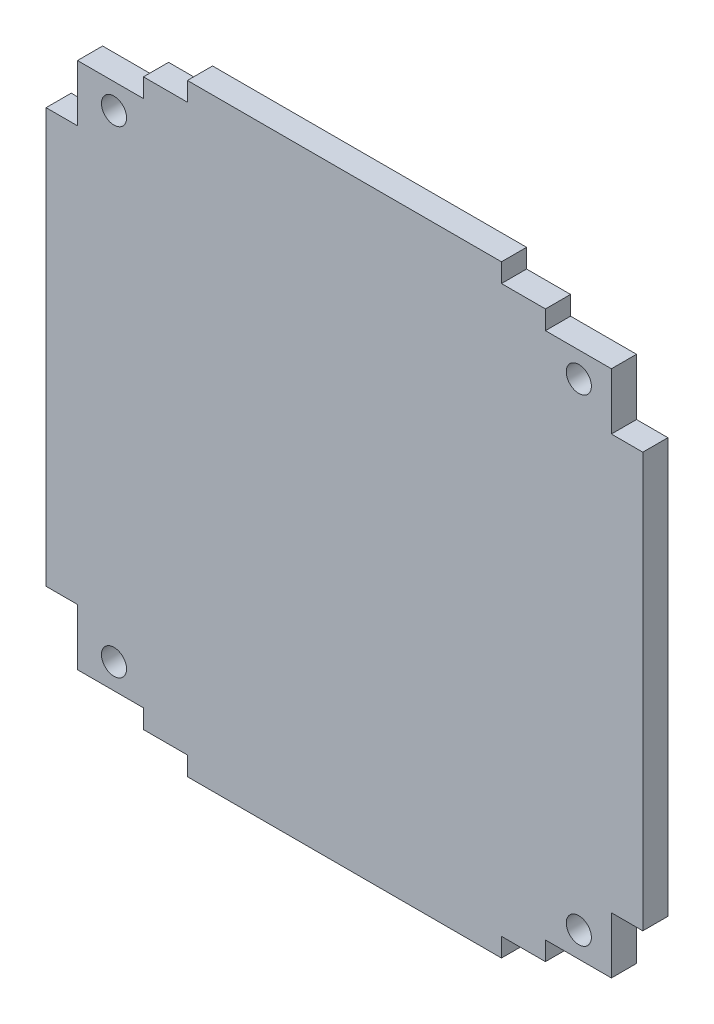
ISO-10303-21;
HEADER;
FILE_DESCRIPTION(('STEP AP214'),'2;1');
FILE_NAME('part.step','',(''),(''),'','','');
FILE_SCHEMA(('AUTOMOTIVE_DESIGN { 1 0 10303 214 1 1 1 1 }'));
ENDSEC;
DATA;
#1=APPLICATION_CONTEXT('core data for automotive mechanical design processes');
#2=APPLICATION_PROTOCOL_DEFINITION('international standard','automotive_design',2000,#1);
#3=PRODUCT_CONTEXT('',#1,'mechanical');
#4=PRODUCT('Part','Part','',(#3));
#5=PRODUCT_RELATED_PRODUCT_CATEGORY('part','',(#4));
#6=PRODUCT_DEFINITION_FORMATION('','',#4);
#7=PRODUCT_DEFINITION_CONTEXT('part definition',#1,'design');
#8=PRODUCT_DEFINITION('design','',#6,#7);
#9=PRODUCT_DEFINITION_SHAPE('','',#8);
#10=(LENGTH_UNIT() NAMED_UNIT(*) SI_UNIT(.MILLI.,.METRE.));
#11=(NAMED_UNIT(*) PLANE_ANGLE_UNIT() SI_UNIT($,.RADIAN.));
#12=(NAMED_UNIT(*) SI_UNIT($,.STERADIAN.) SOLID_ANGLE_UNIT());
#13=UNCERTAINTY_MEASURE_WITH_UNIT(LENGTH_MEASURE(1.E-05),#10,'distance_accuracy_value','');
#14=(GEOMETRIC_REPRESENTATION_CONTEXT(3) GLOBAL_UNCERTAINTY_ASSIGNED_CONTEXT((#13)) GLOBAL_UNIT_ASSIGNED_CONTEXT((#10,
#11,#12)) REPRESENTATION_CONTEXT('',''));
#15=CARTESIAN_POINT('',(0.,0.,0.));
#16=DIRECTION('',(0.,0.,1.));
#17=DIRECTION('',(1.,0.,0.));
#18=AXIS2_PLACEMENT_3D('',#15,#16,#17);
#19=CARTESIAN_POINT('',(42.185985468852,-41.9999998962809,4.));
#20=DIRECTION('',(-0.999999999999999,3.79117308534226E-08,0.));
#21=DIRECTION('',(-3.79117308534226E-08,-0.999999999999999,0.));
#22=AXIS2_PLACEMENT_3D('',#19,#20,#21);
#23=PLANE('',#22);
#24=DIRECTION('',(3.79117308534226E-08,0.999999999999999,0.));
#25=VECTOR('',#24,1.);
#26=CARTESIAN_POINT('',(42.185985468852,-41.9999998962809,0.));
#27=LINE('',#26,#25);
#28=CARTESIAN_POINT('',(42.185985468852,-41.9999998962809,0.));
#29=VERTEX_POINT('',#28);
#30=CARTESIAN_POINT('',(42.1859858100575,-32.9999998962809,0.));
#31=VERTEX_POINT('',#30);
#32=EDGE_CURVE('E259',#29,#31,#27,.T.);
#33=ORIENTED_EDGE('',*,*,#32,.T.);
#34=DIRECTION('',(0.,0.,-1.));
#35=VECTOR('',#34,1.);
#36=CARTESIAN_POINT('',(42.1859858100575,-32.9999998962809,4.));
#37=LINE('',#36,#35);
#38=CARTESIAN_POINT('',(42.1859858100575,-32.9999998962809,4.));
#39=VERTEX_POINT('',#38);
#40=EDGE_CURVE('E11',#39,#31,#37,.T.);
#41=ORIENTED_EDGE('',*,*,#40,.F.);
#42=DIRECTION('',(3.79117308534226E-08,0.999999999999999,0.));
#43=VECTOR('',#42,1.);
#44=CARTESIAN_POINT('',(42.185985468852,-41.9999998962809,4.));
#45=LINE('',#44,#43);
#46=CARTESIAN_POINT('',(42.185985468852,-41.9999998962809,4.));
#47=VERTEX_POINT('',#46);
#48=EDGE_CURVE('E313',#47,#39,#45,.T.);
#49=ORIENTED_EDGE('',*,*,#48,.F.);
#50=DIRECTION('',(0.,0.,-1.));
#51=VECTOR('',#50,1.);
#52=CARTESIAN_POINT('',(42.185985468852,-41.9999998962809,4.));
#53=LINE('',#52,#51);
#54=EDGE_CURVE('E255',#47,#29,#53,.T.);
#55=ORIENTED_EDGE('',*,*,#54,.T.);
#56=EDGE_LOOP('',(#33,#41,#49,#55));
#57=FACE_BOUND('',#56,.T.);
#58=ADVANCED_FACE('F41',(#57),#23,.F.);
#59=CARTESIAN_POINT('',(42.1859858100575,-32.9999998962809,4.));
#60=DIRECTION('',(3.57590861161203E-09,1.,0.));
#61=DIRECTION('',(-1.,3.57590861161203E-09,0.));
#62=AXIS2_PLACEMENT_3D('',#59,#60,#61);
#63=PLANE('',#62);
#64=DIRECTION('',(1.,-3.57590861161203E-09,0.));
#65=VECTOR('',#64,1.);
#66=CARTESIAN_POINT('',(42.1859858100575,-32.9999998962809,0.));
#67=LINE('',#66,#65);
#68=CARTESIAN_POINT('',(47.1859883122317,-32.9999999141604,0.));
#69=VERTEX_POINT('',#68);
#70=EDGE_CURVE('E262',#31,#69,#67,.T.);
#71=ORIENTED_EDGE('',*,*,#70,.T.);
#72=DIRECTION('',(0.,0.,-1.));
#73=VECTOR('',#72,1.);
#74=CARTESIAN_POINT('',(47.1859883122317,-32.9999999141604,4.));
#75=LINE('',#74,#73);
#76=CARTESIAN_POINT('',(47.1859883122317,-32.9999999141604,4.));
#77=VERTEX_POINT('',#76);
#78=EDGE_CURVE('E50',#77,#69,#75,.T.);
#79=ORIENTED_EDGE('',*,*,#78,.F.);
#80=DIRECTION('',(1.,-3.57590861161203E-09,0.));
#81=VECTOR('',#80,1.);
#82=CARTESIAN_POINT('',(42.1859858100575,-32.9999998962809,4.));
#83=LINE('',#82,#81);
#84=EDGE_CURVE('E162',#39,#77,#83,.T.);
#85=ORIENTED_EDGE('',*,*,#84,.F.);
#86=ORIENTED_EDGE('',*,*,#40,.T.);
#87=EDGE_LOOP('',(#71,#79,#85,#86));
#88=FACE_BOUND('',#87,.T.);
#89=ADVANCED_FACE('F427',(#88),#63,.F.);
#90=CARTESIAN_POINT('',(47.1859858100575,33.0000000858395,4.));
#91=DIRECTION('',(-0.999999999999999,-3.79117300473895E-08,0.));
#92=DIRECTION('',(3.79117300473895E-08,-0.999999999999999,0.));
#93=AXIS2_PLACEMENT_3D('',#90,#91,#92);
#94=PLANE('',#93);
#95=DIRECTION('',(-3.79117300473895E-08,0.999999999999999,0.));
#96=VECTOR('',#95,1.);
#97=CARTESIAN_POINT('',(47.1859858100575,33.0000000858395,0.));
#98=LINE('',#97,#96);
#99=CARTESIAN_POINT('',(47.1859858100575,33.0000000858395,0.));
#100=VERTEX_POINT('',#99);
#101=EDGE_CURVE('E264',#69,#100,#98,.T.);
#102=ORIENTED_EDGE('',*,*,#101,.T.);
#103=DIRECTION('',(0.,0.,-1.));
#104=VECTOR('',#103,1.);
#105=CARTESIAN_POINT('',(47.1859858100575,33.0000000858395,4.));
#106=LINE('',#105,#104);
#107=CARTESIAN_POINT('',(47.1859858100575,33.0000000858395,4.));
#108=VERTEX_POINT('',#107);
#109=EDGE_CURVE('E380',#108,#100,#106,.T.);
#110=ORIENTED_EDGE('',*,*,#109,.F.);
#111=DIRECTION('',(-3.79117300473895E-08,0.999999999999999,0.));
#112=VECTOR('',#111,1.);
#113=CARTESIAN_POINT('',(47.1859858100575,33.0000000858395,4.));
#114=LINE('',#113,#112);
#115=EDGE_CURVE('E609',#77,#108,#114,.T.);
#116=ORIENTED_EDGE('',*,*,#115,.F.);
#117=ORIENTED_EDGE('',*,*,#78,.T.);
#118=EDGE_LOOP('',(#102,#110,#116,#117));
#119=FACE_BOUND('',#118,.T.);
#120=ADVANCED_FACE('F431',(#119),#94,.F.);
#121=CARTESIAN_POINT('',(42.1859858100575,32.9999998962809,4.));
#122=DIRECTION('',(3.79117293114462E-08,-0.999999999999999,0.));
#123=DIRECTION('',(0.999999999999999,3.79117293114462E-08,0.));
#124=AXIS2_PLACEMENT_3D('',#121,#122,#123);
#125=PLANE('',#124);
#126=DIRECTION('',(-0.999999999999999,-3.79117293114462E-08,0.));
#127=VECTOR('',#126,1.);
#128=CARTESIAN_POINT('',(42.1859858100575,32.9999998962809,0.));
#129=LINE('',#128,#127);
#130=CARTESIAN_POINT('',(42.1859858100575,32.9999998962809,0.));
#131=VERTEX_POINT('',#130);
#132=EDGE_CURVE('E266',#100,#131,#129,.T.);
#133=ORIENTED_EDGE('',*,*,#132,.T.);
#134=DIRECTION('',(0.,0.,-1.));
#135=VECTOR('',#134,1.);
#136=CARTESIAN_POINT('',(42.1859858100575,32.9999998962809,4.));
#137=LINE('',#136,#135);
#138=CARTESIAN_POINT('',(42.1859858100575,32.9999998962809,4.));
#139=VERTEX_POINT('',#138);
#140=EDGE_CURVE('E377',#139,#131,#137,.T.);
#141=ORIENTED_EDGE('',*,*,#140,.F.);
#142=DIRECTION('',(-0.999999999999999,-3.79117293114462E-08,0.));
#143=VECTOR('',#142,1.);
#144=CARTESIAN_POINT('',(42.1859858100575,32.9999998962809,4.));
#145=LINE('',#144,#143);
#146=EDGE_CURVE('E611',#108,#139,#145,.T.);
#147=ORIENTED_EDGE('',*,*,#146,.F.);
#148=ORIENTED_EDGE('',*,*,#109,.T.);
#149=EDGE_LOOP('',(#133,#141,#147,#148));
#150=FACE_BOUND('',#149,.T.);
#151=ADVANCED_FACE('F435',(#150),#125,.F.);
#152=CARTESIAN_POINT('',(42.185985468852,41.9999998962809,4.));
#153=DIRECTION('',(-0.999999999999999,-3.79117308534226E-08,0.));
#154=DIRECTION('',(3.79117308534226E-08,-0.999999999999999,0.));
#155=AXIS2_PLACEMENT_3D('',#152,#153,#154);
#156=PLANE('',#155);
#157=DIRECTION('',(-3.79117308534226E-08,0.999999999999999,0.));
#158=VECTOR('',#157,1.);
#159=CARTESIAN_POINT('',(42.185985468852,41.9999998962809,0.));
#160=LINE('',#159,#158);
#161=CARTESIAN_POINT('',(42.185985468852,41.9999998962809,0.));
#162=VERTEX_POINT('',#161);
#163=EDGE_CURVE('E268',#131,#162,#160,.T.);
#164=ORIENTED_EDGE('',*,*,#163,.T.);
#165=DIRECTION('',(0.,0.,-1.));
#166=VECTOR('',#165,1.);
#167=CARTESIAN_POINT('',(42.185985468852,41.9999998962809,4.));
#168=LINE('',#167,#166);
#169=CARTESIAN_POINT('',(42.185985468852,41.9999998962809,4.));
#170=VERTEX_POINT('',#169);
#171=EDGE_CURVE('E374',#170,#162,#168,.T.);
#172=ORIENTED_EDGE('',*,*,#171,.F.);
#173=DIRECTION('',(-3.79117308534226E-08,0.999999999999999,0.));
#174=VECTOR('',#173,1.);
#175=CARTESIAN_POINT('',(42.185985468852,41.9999998962809,4.));
#176=LINE('',#175,#174);
#177=EDGE_CURVE('E613',#139,#170,#176,.T.);
#178=ORIENTED_EDGE('',*,*,#177,.F.);
#179=ORIENTED_EDGE('',*,*,#140,.T.);
#180=EDGE_LOOP('',(#164,#172,#178,#179));
#181=FACE_BOUND('',#180,.T.);
#182=ADVANCED_FACE('F441',(#181),#156,.F.);
#183=CARTESIAN_POINT('',(31.6859854688523,41.9999994982078,4.));
#184=DIRECTION('',(3.79117200595888E-08,-0.999999999999999,0.));
#185=DIRECTION('',(0.999999999999999,3.79117200595888E-08,0.));
#186=AXIS2_PLACEMENT_3D('',#183,#184,#185);
#187=PLANE('',#186);
#188=DIRECTION('',(-0.999999999999999,-3.79117200595888E-08,0.));
#189=VECTOR('',#188,1.);
#190=CARTESIAN_POINT('',(31.6859854688523,41.9999994982078,0.));
#191=LINE('',#190,#189);
#192=CARTESIAN_POINT('',(31.6859854688523,41.9999994982078,0.));
#193=VERTEX_POINT('',#192);
#194=EDGE_CURVE('E270',#162,#193,#191,.T.);
#195=ORIENTED_EDGE('',*,*,#194,.T.);
#196=DIRECTION('',(0.,0.,-1.));
#197=VECTOR('',#196,1.);
#198=CARTESIAN_POINT('',(31.6859854688523,41.9999994982078,4.));
#199=LINE('',#198,#197);
#200=CARTESIAN_POINT('',(31.6859854688523,41.9999994982078,4.));
#201=VERTEX_POINT('',#200);
#202=EDGE_CURVE('E371',#201,#193,#199,.T.);
#203=ORIENTED_EDGE('',*,*,#202,.F.);
#204=DIRECTION('',(-0.999999999999999,-3.79117200595888E-08,0.));
#205=VECTOR('',#204,1.);
#206=CARTESIAN_POINT('',(31.6859854688523,41.9999994982078,4.));
#207=LINE('',#206,#205);
#208=EDGE_CURVE('E615',#170,#201,#207,.T.);
#209=ORIENTED_EDGE('',*,*,#208,.F.);
#210=ORIENTED_EDGE('',*,*,#171,.T.);
#211=EDGE_LOOP('',(#195,#203,#209,#210));
#212=FACE_BOUND('',#211,.T.);
#213=ADVANCED_FACE('F445',(#212),#187,.F.);
#214=CARTESIAN_POINT('',(31.6859853551171,44.9999994982078,4.));
#215=DIRECTION('',(-0.999999999999999,-3.79117293114463E-08,0.));
#216=DIRECTION('',(3.79117293114463E-08,-0.999999999999999,0.));
#217=AXIS2_PLACEMENT_3D('',#214,#215,#216);
#218=PLANE('',#217);
#219=DIRECTION('',(-3.79117293114463E-08,0.999999999999999,0.));
#220=VECTOR('',#219,1.);
#221=CARTESIAN_POINT('',(31.6859853551171,44.9999994982078,0.));
#222=LINE('',#221,#220);
#223=CARTESIAN_POINT('',(31.6859853551171,44.9999994982078,0.));
#224=VERTEX_POINT('',#223);
#225=EDGE_CURVE('E272',#193,#224,#222,.T.);
#226=ORIENTED_EDGE('',*,*,#225,.T.);
#227=DIRECTION('',(0.,0.,-1.));
#228=VECTOR('',#227,1.);
#229=CARTESIAN_POINT('',(31.6859853551171,44.9999994982078,4.));
#230=LINE('',#229,#228);
#231=CARTESIAN_POINT('',(31.6859853551171,44.9999994982078,4.));
#232=VERTEX_POINT('',#231);
#233=EDGE_CURVE('E368',#232,#224,#230,.T.);
#234=ORIENTED_EDGE('',*,*,#233,.F.);
#235=DIRECTION('',(-3.79117293114463E-08,0.999999999999999,0.));
#236=VECTOR('',#235,1.);
#237=CARTESIAN_POINT('',(31.6859853551171,44.9999994982078,4.));
#238=LINE('',#237,#236);
#239=EDGE_CURVE('E617',#201,#232,#238,.T.);
#240=ORIENTED_EDGE('',*,*,#239,.F.);
#241=ORIENTED_EDGE('',*,*,#202,.T.);
#242=EDGE_LOOP('',(#226,#234,#240,#241));
#243=FACE_BOUND('',#242,.T.);
#244=ADVANCED_FACE('F449',(#243),#218,.F.);
#245=CARTESIAN_POINT('',(24.6859853551169,44.9999992328257,4.));
#246=DIRECTION('',(3.79117303027153E-08,-0.999999999999999,0.));
#247=DIRECTION('',(0.999999999999999,3.79117303027153E-08,0.));
#248=AXIS2_PLACEMENT_3D('',#245,#246,#247);
#249=PLANE('',#248);
#250=DIRECTION('',(-0.999999999999999,-3.79117303027153E-08,0.));
#251=VECTOR('',#250,1.);
#252=CARTESIAN_POINT('',(24.6859853551169,44.9999992328257,0.));
#253=LINE('',#252,#251);
#254=CARTESIAN_POINT('',(24.6859853551169,44.9999992328257,0.));
#255=VERTEX_POINT('',#254);
#256=EDGE_CURVE('E274',#224,#255,#253,.T.);
#257=ORIENTED_EDGE('',*,*,#256,.T.);
#258=DIRECTION('',(0.,0.,-1.));
#259=VECTOR('',#258,1.);
#260=CARTESIAN_POINT('',(24.6859853551169,44.9999992328257,4.));
#261=LINE('',#260,#259);
#262=CARTESIAN_POINT('',(24.6859853551169,44.9999992328257,4.));
#263=VERTEX_POINT('',#262);
#264=EDGE_CURVE('E365',#263,#255,#261,.T.);
#265=ORIENTED_EDGE('',*,*,#264,.F.);
#266=DIRECTION('',(-0.999999999999999,-3.79117303027153E-08,0.));
#267=VECTOR('',#266,1.);
#268=CARTESIAN_POINT('',(24.6859853551169,44.9999992328257,4.));
#269=LINE('',#268,#267);
#270=EDGE_CURVE('E619',#232,#263,#269,.T.);
#271=ORIENTED_EDGE('',*,*,#270,.F.);
#272=ORIENTED_EDGE('',*,*,#233,.T.);
#273=EDGE_LOOP('',(#257,#265,#271,#272));
#274=FACE_BOUND('',#273,.T.);
#275=ADVANCED_FACE('F453',(#274),#249,.F.);
#276=CARTESIAN_POINT('',(24.6859852413817,47.9999992328257,4.));
#277=DIRECTION('',(-0.999999999999999,-3.79117293114461E-08,0.));
#278=DIRECTION('',(3.79117293114461E-08,-0.999999999999999,0.));
#279=AXIS2_PLACEMENT_3D('',#276,#277,#278);
#280=PLANE('',#279);
#281=DIRECTION('',(-3.79117293114461E-08,0.999999999999999,0.));
#282=VECTOR('',#281,1.);
#283=CARTESIAN_POINT('',(24.6859852413817,47.9999992328257,0.));
#284=LINE('',#283,#282);
#285=CARTESIAN_POINT('',(24.6859852413817,47.9999992328257,0.));
#286=VERTEX_POINT('',#285);
#287=EDGE_CURVE('E276',#255,#286,#284,.T.);
#288=ORIENTED_EDGE('',*,*,#287,.T.);
#289=DIRECTION('',(0.,0.,-1.));
#290=VECTOR('',#289,1.);
#291=CARTESIAN_POINT('',(24.6859852413817,47.9999992328257,4.));
#292=LINE('',#291,#290);
#293=CARTESIAN_POINT('',(24.6859852413817,47.9999992328257,4.));
#294=VERTEX_POINT('',#293);
#295=EDGE_CURVE('E362',#294,#286,#292,.T.);
#296=ORIENTED_EDGE('',*,*,#295,.F.);
#297=DIRECTION('',(-3.79117293114461E-08,0.999999999999999,0.));
#298=VECTOR('',#297,1.);
#299=CARTESIAN_POINT('',(24.6859852413817,47.9999992328257,4.));
#300=LINE('',#299,#298);
#301=EDGE_CURVE('E621',#263,#294,#300,.T.);
#302=ORIENTED_EDGE('',*,*,#301,.F.);
#303=ORIENTED_EDGE('',*,*,#264,.T.);
#304=EDGE_LOOP('',(#288,#296,#302,#303));
#305=FACE_BOUND('',#304,.T.);
#306=ADVANCED_FACE('F457',(#305),#280,.F.);
#307=CARTESIAN_POINT('',(-25.3140147586183,47.9999973372392,4.));
#308=DIRECTION('',(3.79117302828913E-08,-0.999999999999999,0.));
#309=DIRECTION('',(0.999999999999999,3.79117302828913E-08,0.));
#310=AXIS2_PLACEMENT_3D('',#307,#308,#309);
#311=PLANE('',#310);
#312=DIRECTION('',(-0.999999999999999,-3.79117302828913E-08,0.));
#313=VECTOR('',#312,1.);
#314=CARTESIAN_POINT('',(-25.3140147586183,47.9999973372392,0.));
#315=LINE('',#314,#313);
#316=CARTESIAN_POINT('',(-25.3140147586183,47.9999973372392,0.));
#317=VERTEX_POINT('',#316);
#318=EDGE_CURVE('E278',#286,#317,#315,.T.);
#319=ORIENTED_EDGE('',*,*,#318,.T.);
#320=DIRECTION('',(0.,0.,-1.));
#321=VECTOR('',#320,1.);
#322=CARTESIAN_POINT('',(-25.3140147586183,47.9999973372392,4.));
#323=LINE('',#322,#321);
#324=CARTESIAN_POINT('',(-25.3140147586183,47.9999973372392,4.));
#325=VERTEX_POINT('',#324);
#326=EDGE_CURVE('E359',#325,#317,#323,.T.);
#327=ORIENTED_EDGE('',*,*,#326,.F.);
#328=DIRECTION('',(-0.999999999999999,-3.79117302828913E-08,0.));
#329=VECTOR('',#328,1.);
#330=CARTESIAN_POINT('',(-25.3140147586183,47.9999973372392,4.));
#331=LINE('',#330,#329);
#332=EDGE_CURVE('E623',#294,#325,#331,.T.);
#333=ORIENTED_EDGE('',*,*,#332,.F.);
#334=ORIENTED_EDGE('',*,*,#295,.T.);
#335=EDGE_LOOP('',(#319,#327,#333,#334));
#336=FACE_BOUND('',#335,.T.);
#337=ADVANCED_FACE('F461',(#336),#311,.F.);
#338=CARTESIAN_POINT('',(-25.3140146448831,44.9999973372392,4.));
#339=DIRECTION('',(0.999999999999999,3.79117304679285E-08,0.));
#340=DIRECTION('',(-3.79117304679285E-08,0.999999999999999,0.));
#341=AXIS2_PLACEMENT_3D('',#338,#339,#340);
#342=PLANE('',#341);
#343=DIRECTION('',(3.79117304679285E-08,-0.999999999999999,0.));
#344=VECTOR('',#343,1.);
#345=CARTESIAN_POINT('',(-25.3140146448831,44.9999973372392,0.));
#346=LINE('',#345,#344);
#347=CARTESIAN_POINT('',(-25.3140146448831,44.9999973372392,0.));
#348=VERTEX_POINT('',#347);
#349=EDGE_CURVE('E280',#317,#348,#346,.T.);
#350=ORIENTED_EDGE('',*,*,#349,.T.);
#351=DIRECTION('',(0.,0.,-1.));
#352=VECTOR('',#351,1.);
#353=CARTESIAN_POINT('',(-25.3140146448831,44.9999973372392,4.));
#354=LINE('',#353,#352);
#355=CARTESIAN_POINT('',(-25.3140146448831,44.9999973372392,4.));
#356=VERTEX_POINT('',#355);
#357=EDGE_CURVE('E356',#356,#348,#354,.T.);
#358=ORIENTED_EDGE('',*,*,#357,.F.);
#359=DIRECTION('',(3.79117304679285E-08,-0.999999999999999,0.));
#360=VECTOR('',#359,1.);
#361=CARTESIAN_POINT('',(-25.3140146448831,44.9999973372392,4.));
#362=LINE('',#361,#360);
#363=EDGE_CURVE('E625',#325,#356,#362,.T.);
#364=ORIENTED_EDGE('',*,*,#363,.F.);
#365=ORIENTED_EDGE('',*,*,#326,.T.);
#366=EDGE_LOOP('',(#350,#358,#364,#365));
#367=FACE_BOUND('',#366,.T.);
#368=ADVANCED_FACE('F465',(#367),#342,.F.);
#369=CARTESIAN_POINT('',(-32.3140146448834,44.9999970718571,4.));
#370=DIRECTION('',(3.79117303027152E-08,-0.999999999999999,0.));
#371=DIRECTION('',(0.999999999999999,3.79117303027152E-08,0.));
#372=AXIS2_PLACEMENT_3D('',#369,#370,#371);
#373=PLANE('',#372);
#374=DIRECTION('',(-0.999999999999999,-3.79117303027152E-08,0.));
#375=VECTOR('',#374,1.);
#376=CARTESIAN_POINT('',(-32.3140146448834,44.9999970718571,0.));
#377=LINE('',#376,#375);
#378=CARTESIAN_POINT('',(-32.3140146448834,44.9999970718571,0.));
#379=VERTEX_POINT('',#378);
#380=EDGE_CURVE('E282',#348,#379,#377,.T.);
#381=ORIENTED_EDGE('',*,*,#380,.T.);
#382=DIRECTION('',(0.,0.,-1.));
#383=VECTOR('',#382,1.);
#384=CARTESIAN_POINT('',(-32.3140146448834,44.9999970718571,4.));
#385=LINE('',#384,#383);
#386=CARTESIAN_POINT('',(-32.3140146448834,44.9999970718571,4.));
#387=VERTEX_POINT('',#386);
#388=EDGE_CURVE('E353',#387,#379,#385,.T.);
#389=ORIENTED_EDGE('',*,*,#388,.F.);
#390=DIRECTION('',(-0.999999999999999,-3.79117303027152E-08,0.));
#391=VECTOR('',#390,1.);
#392=CARTESIAN_POINT('',(-32.3140146448834,44.9999970718571,4.));
#393=LINE('',#392,#391);
#394=EDGE_CURVE('E627',#356,#387,#393,.T.);
#395=ORIENTED_EDGE('',*,*,#394,.F.);
#396=ORIENTED_EDGE('',*,*,#357,.T.);
#397=EDGE_LOOP('',(#381,#389,#395,#396));
#398=FACE_BOUND('',#397,.T.);
#399=ADVANCED_FACE('F469',(#398),#373,.F.);
#400=CARTESIAN_POINT('',(-32.3140145311482,41.9999970718571,4.));
#401=DIRECTION('',(0.999999999999999,3.79117316244108E-08,0.));
#402=DIRECTION('',(-3.79117316244108E-08,0.999999999999999,0.));
#403=AXIS2_PLACEMENT_3D('',#400,#401,#402);
#404=PLANE('',#403);
#405=DIRECTION('',(3.79117316244108E-08,-0.999999999999999,0.));
#406=VECTOR('',#405,1.);
#407=CARTESIAN_POINT('',(-32.3140145311482,41.9999970718571,0.));
#408=LINE('',#407,#406);
#409=CARTESIAN_POINT('',(-32.3140145311482,41.9999970718571,0.));
#410=VERTEX_POINT('',#409);
#411=EDGE_CURVE('E284',#379,#410,#408,.T.);
#412=ORIENTED_EDGE('',*,*,#411,.T.);
#413=DIRECTION('',(0.,0.,-1.));
#414=VECTOR('',#413,1.);
#415=CARTESIAN_POINT('',(-32.3140145311482,41.9999970718571,4.));
#416=LINE('',#415,#414);
#417=CARTESIAN_POINT('',(-32.3140145311482,41.9999970718571,4.));
#418=VERTEX_POINT('',#417);
#419=EDGE_CURVE('E350',#418,#410,#416,.T.);
#420=ORIENTED_EDGE('',*,*,#419,.F.);
#421=DIRECTION('',(3.79117316244108E-08,-0.999999999999999,0.));
#422=VECTOR('',#421,1.);
#423=CARTESIAN_POINT('',(-32.3140145311482,41.9999970718571,4.));
#424=LINE('',#423,#422);
#425=EDGE_CURVE('E629',#387,#418,#424,.T.);
#426=ORIENTED_EDGE('',*,*,#425,.F.);
#427=ORIENTED_EDGE('',*,*,#388,.T.);
#428=EDGE_LOOP('',(#412,#420,#426,#427));
#429=FACE_BOUND('',#428,.T.);
#430=ADVANCED_FACE('F473',(#429),#404,.F.);
#431=CARTESIAN_POINT('',(-42.814014531148,41.9999966737837,4.));
#432=DIRECTION('',(3.79117484760109E-08,-0.999999999999999,0.));
#433=DIRECTION('',(0.999999999999999,3.79117484760109E-08,0.));
#434=AXIS2_PLACEMENT_3D('',#431,#432,#433);
#435=PLANE('',#434);
#436=DIRECTION('',(-0.999999999999999,-3.79117484760109E-08,0.));
#437=VECTOR('',#436,1.);
#438=CARTESIAN_POINT('',(-42.814014531148,41.9999966737837,0.));
#439=LINE('',#438,#437);
#440=CARTESIAN_POINT('',(-42.814014531148,41.9999966737837,0.));
#441=VERTEX_POINT('',#440);
#442=EDGE_CURVE('E286',#410,#441,#439,.T.);
#443=ORIENTED_EDGE('',*,*,#442,.T.);
#444=DIRECTION('',(0.,0.,-1.));
#445=VECTOR('',#444,1.);
#446=CARTESIAN_POINT('',(-42.814014531148,41.9999966737837,4.));
#447=LINE('',#446,#445);
#448=CARTESIAN_POINT('',(-42.814014531148,41.9999966737837,4.));
#449=VERTEX_POINT('',#448);
#450=EDGE_CURVE('E347',#449,#441,#447,.T.);
#451=ORIENTED_EDGE('',*,*,#450,.F.);
#452=DIRECTION('',(-0.999999999999999,-3.79117484760109E-08,0.));
#453=VECTOR('',#452,1.);
#454=CARTESIAN_POINT('',(-42.814014531148,41.9999966737837,4.));
#455=LINE('',#454,#453);
#456=EDGE_CURVE('E631',#418,#449,#455,.T.);
#457=ORIENTED_EDGE('',*,*,#456,.F.);
#458=ORIENTED_EDGE('',*,*,#419,.T.);
#459=EDGE_LOOP('',(#443,#451,#457,#458));
#460=FACE_BOUND('',#459,.T.);
#461=ADVANCED_FACE('F477',(#460),#435,.F.);
#462=CARTESIAN_POINT('',(-42.8140141899426,32.9999966737837,4.));
#463=DIRECTION('',(0.999999999999999,3.79117108077292E-08,0.));
#464=DIRECTION('',(-3.79117108077292E-08,0.999999999999999,0.));
#465=AXIS2_PLACEMENT_3D('',#462,#463,#464);
#466=PLANE('',#465);
#467=DIRECTION('',(3.79117108077292E-08,-0.999999999999999,0.));
#468=VECTOR('',#467,1.);
#469=CARTESIAN_POINT('',(-42.8140141899426,32.9999966737837,0.));
#470=LINE('',#469,#468);
#471=CARTESIAN_POINT('',(-42.8140141899426,32.9999966737837,0.));
#472=VERTEX_POINT('',#471);
#473=EDGE_CURVE('E288',#441,#472,#470,.T.);
#474=ORIENTED_EDGE('',*,*,#473,.T.);
#475=DIRECTION('',(0.,0.,-1.));
#476=VECTOR('',#475,1.);
#477=CARTESIAN_POINT('',(-42.8140141899426,32.9999966737837,4.));
#478=LINE('',#477,#476);
#479=CARTESIAN_POINT('',(-42.8140141899426,32.9999966737837,4.));
#480=VERTEX_POINT('',#479);
#481=EDGE_CURVE('E344',#480,#472,#478,.T.);
#482=ORIENTED_EDGE('',*,*,#481,.F.);
#483=DIRECTION('',(3.79117108077292E-08,-0.999999999999999,0.));
#484=VECTOR('',#483,1.);
#485=CARTESIAN_POINT('',(-42.8140141899426,32.9999966737837,4.));
#486=LINE('',#485,#484);
#487=EDGE_CURVE('E633',#449,#480,#486,.T.);
#488=ORIENTED_EDGE('',*,*,#487,.F.);
#489=ORIENTED_EDGE('',*,*,#450,.T.);
#490=EDGE_LOOP('',(#474,#482,#488,#489));
#491=FACE_BOUND('',#490,.T.);
#492=ADVANCED_FACE('F481',(#491),#466,.F.);
#493=CARTESIAN_POINT('',(-47.8140141899424,32.9999964842251,4.));
#494=DIRECTION('',(3.79117320870051E-08,-0.999999999999999,0.));
#495=DIRECTION('',(0.999999999999999,3.79117320870051E-08,0.));
#496=AXIS2_PLACEMENT_3D('',#493,#494,#495);
#497=PLANE('',#496);
#498=DIRECTION('',(-0.999999999999999,-3.79117320870051E-08,0.));
#499=VECTOR('',#498,1.);
#500=CARTESIAN_POINT('',(-47.8140141899424,32.9999964842251,0.));
#501=LINE('',#500,#499);
#502=CARTESIAN_POINT('',(-47.8140141899424,32.9999964842251,0.));
#503=VERTEX_POINT('',#502);
#504=EDGE_CURVE('E290',#472,#503,#501,.T.);
#505=ORIENTED_EDGE('',*,*,#504,.T.);
#506=DIRECTION('',(0.,0.,-1.));
#507=VECTOR('',#506,1.);
#508=CARTESIAN_POINT('',(-47.8140141899424,32.9999964842251,4.));
#509=LINE('',#508,#507);
#510=CARTESIAN_POINT('',(-47.8140141899424,32.9999964842251,4.));
#511=VERTEX_POINT('',#510);
#512=EDGE_CURVE('E341',#511,#503,#509,.T.);
#513=ORIENTED_EDGE('',*,*,#512,.F.);
#514=DIRECTION('',(-0.999999999999999,-3.79117320870051E-08,0.));
#515=VECTOR('',#514,1.);
#516=CARTESIAN_POINT('',(-47.8140141899424,32.9999964842251,4.));
#517=LINE('',#516,#515);
#518=EDGE_CURVE('E635',#480,#511,#517,.T.);
#519=ORIENTED_EDGE('',*,*,#518,.F.);
#520=ORIENTED_EDGE('',*,*,#481,.T.);
#521=EDGE_LOOP('',(#505,#513,#519,#520));
#522=FACE_BOUND('',#521,.T.);
#523=ADVANCED_FACE('F485',(#522),#497,.F.);
#524=CARTESIAN_POINT('',(-47.8140141899424,32.9999964842251,4.));
#525=DIRECTION('',(1.,0.,0.));
#526=DIRECTION('',(0.,0.,-1.));
#527=AXIS2_PLACEMENT_3D('',#524,#525,#526);
#528=PLANE('',#527);
#529=DIRECTION('',(0.,-1.,0.));
#530=VECTOR('',#529,1.);
#531=CARTESIAN_POINT('',(-47.8140141899424,32.9999964842251,0.));
#532=LINE('',#531,#530);
#533=CARTESIAN_POINT('',(-47.8140141899424,-32.9999964842251,0.));
#534=VERTEX_POINT('',#533);
#535=EDGE_CURVE('E292',#503,#534,#532,.T.);
#536=ORIENTED_EDGE('',*,*,#535,.T.);
#537=DIRECTION('',(0.,0.,-1.));
#538=VECTOR('',#537,1.);
#539=CARTESIAN_POINT('',(-47.8140141899424,-32.9999964842251,4.));
#540=LINE('',#539,#538);
#541=CARTESIAN_POINT('',(-47.8140141899424,-32.9999964842251,4.));
#542=VERTEX_POINT('',#541);
#543=EDGE_CURVE('E338',#542,#534,#540,.T.);
#544=ORIENTED_EDGE('',*,*,#543,.F.);
#545=DIRECTION('',(0.,-1.,0.));
#546=VECTOR('',#545,1.);
#547=CARTESIAN_POINT('',(-47.8140141899424,32.9999964842251,4.));
#548=LINE('',#547,#546);
#549=EDGE_CURVE('E637',#511,#542,#548,.T.);
#550=ORIENTED_EDGE('',*,*,#549,.F.);
#551=ORIENTED_EDGE('',*,*,#512,.T.);
#552=EDGE_LOOP('',(#536,#544,#550,#551));
#553=FACE_BOUND('',#552,.T.);
#554=ADVANCED_FACE('F489',(#553),#528,.F.);
#555=CARTESIAN_POINT('',(-47.8140141899424,-32.9999964842251,4.));
#556=DIRECTION('',(3.79117320870051E-08,0.999999999999999,0.));
#557=DIRECTION('',(-0.999999999999999,3.79117320870051E-08,0.));
#558=AXIS2_PLACEMENT_3D('',#555,#556,#557);
#559=PLANE('',#558);
#560=DIRECTION('',(0.999999999999999,-3.79117320870051E-08,0.));
#561=VECTOR('',#560,1.);
#562=CARTESIAN_POINT('',(-47.8140141899424,-32.9999964842251,0.));
#563=LINE('',#562,#561);
#564=CARTESIAN_POINT('',(-42.8140141899426,-32.9999966737837,0.));
#565=VERTEX_POINT('',#564);
#566=EDGE_CURVE('E294',#534,#565,#563,.T.);
#567=ORIENTED_EDGE('',*,*,#566,.T.);
#568=DIRECTION('',(0.,0.,-1.));
#569=VECTOR('',#568,1.);
#570=CARTESIAN_POINT('',(-42.8140141899426,-32.9999966737837,4.));
#571=LINE('',#570,#569);
#572=CARTESIAN_POINT('',(-42.8140141899426,-32.9999966737837,4.));
#573=VERTEX_POINT('',#572);
#574=EDGE_CURVE('E335',#573,#565,#571,.T.);
#575=ORIENTED_EDGE('',*,*,#574,.F.);
#576=DIRECTION('',(0.999999999999999,-3.79117320870051E-08,0.));
#577=VECTOR('',#576,1.);
#578=CARTESIAN_POINT('',(-47.8140141899424,-32.9999964842251,4.));
#579=LINE('',#578,#577);
#580=EDGE_CURVE('E639',#542,#573,#579,.T.);
#581=ORIENTED_EDGE('',*,*,#580,.F.);
#582=ORIENTED_EDGE('',*,*,#543,.T.);
#583=EDGE_LOOP('',(#567,#575,#581,#582));
#584=FACE_BOUND('',#583,.T.);
#585=ADVANCED_FACE('F493',(#584),#559,.F.);
#586=CARTESIAN_POINT('',(-42.8140141899426,-32.9999966737837,4.));
#587=DIRECTION('',(0.999999999999999,-3.79117108077292E-08,0.));
#588=DIRECTION('',(3.79117108077292E-08,0.999999999999999,0.));
#589=AXIS2_PLACEMENT_3D('',#586,#587,#588);
#590=PLANE('',#589);
#591=DIRECTION('',(-3.79117108077292E-08,-0.999999999999999,0.));
#592=VECTOR('',#591,1.);
#593=CARTESIAN_POINT('',(-42.8140141899426,-32.9999966737837,0.));
#594=LINE('',#593,#592);
#595=CARTESIAN_POINT('',(-42.814014531148,-41.9999966737837,0.));
#596=VERTEX_POINT('',#595);
#597=EDGE_CURVE('E296',#565,#596,#594,.T.);
#598=ORIENTED_EDGE('',*,*,#597,.T.);
#599=DIRECTION('',(0.,0.,-1.));
#600=VECTOR('',#599,1.);
#601=CARTESIAN_POINT('',(-42.814014531148,-41.9999966737837,4.));
#602=LINE('',#601,#600);
#603=CARTESIAN_POINT('',(-42.814014531148,-41.9999966737837,4.));
#604=VERTEX_POINT('',#603);
#605=EDGE_CURVE('E332',#604,#596,#602,.T.);
#606=ORIENTED_EDGE('',*,*,#605,.F.);
#607=DIRECTION('',(-3.79117108077292E-08,-0.999999999999999,0.));
#608=VECTOR('',#607,1.);
#609=CARTESIAN_POINT('',(-42.8140141899426,-32.9999966737837,4.));
#610=LINE('',#609,#608);
#611=EDGE_CURVE('E641',#573,#604,#610,.T.);
#612=ORIENTED_EDGE('',*,*,#611,.F.);
#613=ORIENTED_EDGE('',*,*,#574,.T.);
#614=EDGE_LOOP('',(#598,#606,#612,#613));
#615=FACE_BOUND('',#614,.T.);
#616=ADVANCED_FACE('F497',(#615),#590,.F.);
#617=CARTESIAN_POINT('',(-42.814014531148,-41.9999966737837,4.));
#618=DIRECTION('',(3.79117484760109E-08,0.999999999999999,0.));
#619=DIRECTION('',(-0.999999999999999,3.79117484760109E-08,0.));
#620=AXIS2_PLACEMENT_3D('',#617,#618,#619);
#621=PLANE('',#620);
#622=DIRECTION('',(0.999999999999999,-3.79117484760109E-08,0.));
#623=VECTOR('',#622,1.);
#624=CARTESIAN_POINT('',(-42.814014531148,-41.9999966737837,0.));
#625=LINE('',#624,#623);
#626=CARTESIAN_POINT('',(-32.3140145311482,-41.9999970718571,0.));
#627=VERTEX_POINT('',#626);
#628=EDGE_CURVE('E298',#596,#627,#625,.T.);
#629=ORIENTED_EDGE('',*,*,#628,.T.);
#630=DIRECTION('',(0.,0.,-1.));
#631=VECTOR('',#630,1.);
#632=CARTESIAN_POINT('',(-32.3140145311482,-41.9999970718571,4.));
#633=LINE('',#632,#631);
#634=CARTESIAN_POINT('',(-32.3140145311482,-41.9999970718571,4.));
#635=VERTEX_POINT('',#634);
#636=EDGE_CURVE('E329',#635,#627,#633,.T.);
#637=ORIENTED_EDGE('',*,*,#636,.F.);
#638=DIRECTION('',(0.999999999999999,-3.79117484760109E-08,0.));
#639=VECTOR('',#638,1.);
#640=CARTESIAN_POINT('',(-42.814014531148,-41.9999966737837,4.));
#641=LINE('',#640,#639);
#642=EDGE_CURVE('E643',#604,#635,#641,.T.);
#643=ORIENTED_EDGE('',*,*,#642,.F.);
#644=ORIENTED_EDGE('',*,*,#605,.T.);
#645=EDGE_LOOP('',(#629,#637,#643,#644));
#646=FACE_BOUND('',#645,.T.);
#647=ADVANCED_FACE('F501',(#646),#621,.F.);
#648=CARTESIAN_POINT('',(-32.3140145311482,-41.9999970718571,4.));
#649=DIRECTION('',(0.999999999999999,-3.79117316244108E-08,0.));
#650=DIRECTION('',(3.79117316244108E-08,0.999999999999999,0.));
#651=AXIS2_PLACEMENT_3D('',#648,#649,#650);
#652=PLANE('',#651);
#653=DIRECTION('',(-3.79117316244108E-08,-0.999999999999999,0.));
#654=VECTOR('',#653,1.);
#655=CARTESIAN_POINT('',(-32.3140145311482,-41.9999970718571,0.));
#656=LINE('',#655,#654);
#657=CARTESIAN_POINT('',(-32.3140146448834,-44.9999970718571,0.));
#658=VERTEX_POINT('',#657);
#659=EDGE_CURVE('E300',#627,#658,#656,.T.);
#660=ORIENTED_EDGE('',*,*,#659,.T.);
#661=DIRECTION('',(0.,0.,-1.));
#662=VECTOR('',#661,1.);
#663=CARTESIAN_POINT('',(-32.3140146448834,-44.9999970718571,4.));
#664=LINE('',#663,#662);
#665=CARTESIAN_POINT('',(-32.3140146448834,-44.9999970718571,4.));
#666=VERTEX_POINT('',#665);
#667=EDGE_CURVE('E326',#666,#658,#664,.T.);
#668=ORIENTED_EDGE('',*,*,#667,.F.);
#669=DIRECTION('',(-3.79117316244108E-08,-0.999999999999999,0.));
#670=VECTOR('',#669,1.);
#671=CARTESIAN_POINT('',(-32.3140145311482,-41.9999970718571,4.));
#672=LINE('',#671,#670);
#673=EDGE_CURVE('E645',#635,#666,#672,.T.);
#674=ORIENTED_EDGE('',*,*,#673,.F.);
#675=ORIENTED_EDGE('',*,*,#636,.T.);
#676=EDGE_LOOP('',(#660,#668,#674,#675));
#677=FACE_BOUND('',#676,.T.);
#678=ADVANCED_FACE('F505',(#677),#652,.F.);
#679=CARTESIAN_POINT('',(-32.3140146448834,-44.9999970718571,4.));
#680=DIRECTION('',(3.79117303027152E-08,0.999999999999999,0.));
#681=DIRECTION('',(-0.999999999999999,3.79117303027152E-08,0.));
#682=AXIS2_PLACEMENT_3D('',#679,#680,#681);
#683=PLANE('',#682);
#684=DIRECTION('',(0.999999999999999,-3.79117303027152E-08,0.));
#685=VECTOR('',#684,1.);
#686=CARTESIAN_POINT('',(-32.3140146448834,-44.9999970718571,0.));
#687=LINE('',#686,#685);
#688=CARTESIAN_POINT('',(-25.3140146448831,-44.9999973372392,0.));
#689=VERTEX_POINT('',#688);
#690=EDGE_CURVE('E302',#658,#689,#687,.T.);
#691=ORIENTED_EDGE('',*,*,#690,.T.);
#692=DIRECTION('',(0.,0.,-1.));
#693=VECTOR('',#692,1.);
#694=CARTESIAN_POINT('',(-25.3140146448831,-44.9999973372392,4.));
#695=LINE('',#694,#693);
#696=CARTESIAN_POINT('',(-25.3140146448831,-44.9999973372392,4.));
#697=VERTEX_POINT('',#696);
#698=EDGE_CURVE('E323',#697,#689,#695,.T.);
#699=ORIENTED_EDGE('',*,*,#698,.F.);
#700=DIRECTION('',(0.999999999999999,-3.79117303027152E-08,0.));
#701=VECTOR('',#700,1.);
#702=CARTESIAN_POINT('',(-32.3140146448834,-44.9999970718571,4.));
#703=LINE('',#702,#701);
#704=EDGE_CURVE('E647',#666,#697,#703,.T.);
#705=ORIENTED_EDGE('',*,*,#704,.F.);
#706=ORIENTED_EDGE('',*,*,#667,.T.);
#707=EDGE_LOOP('',(#691,#699,#705,#706));
#708=FACE_BOUND('',#707,.T.);
#709=ADVANCED_FACE('F509',(#708),#683,.F.);
#710=CARTESIAN_POINT('',(-25.3140146448831,-44.9999973372392,4.));
#711=DIRECTION('',(0.999999999999999,-3.79117304679285E-08,0.));
#712=DIRECTION('',(3.79117304679285E-08,0.999999999999999,0.));
#713=AXIS2_PLACEMENT_3D('',#710,#711,#712);
#714=PLANE('',#713);
#715=DIRECTION('',(-3.79117304679285E-08,-0.999999999999999,0.));
#716=VECTOR('',#715,1.);
#717=CARTESIAN_POINT('',(-25.3140146448831,-44.9999973372392,0.));
#718=LINE('',#717,#716);
#719=CARTESIAN_POINT('',(-25.3140147586183,-47.9999973372392,0.));
#720=VERTEX_POINT('',#719);
#721=EDGE_CURVE('E304',#689,#720,#718,.T.);
#722=ORIENTED_EDGE('',*,*,#721,.T.);
#723=DIRECTION('',(0.,0.,-1.));
#724=VECTOR('',#723,1.);
#725=CARTESIAN_POINT('',(-25.3140147586183,-47.9999973372392,4.));
#726=LINE('',#725,#724);
#727=CARTESIAN_POINT('',(-25.3140147586183,-47.9999973372392,4.));
#728=VERTEX_POINT('',#727);
#729=EDGE_CURVE('E320',#728,#720,#726,.T.);
#730=ORIENTED_EDGE('',*,*,#729,.F.);
#731=DIRECTION('',(-3.79117304679285E-08,-0.999999999999999,0.));
#732=VECTOR('',#731,1.);
#733=CARTESIAN_POINT('',(-25.3140146448831,-44.9999973372392,4.));
#734=LINE('',#733,#732);
#735=EDGE_CURVE('E649',#697,#728,#734,.T.);
#736=ORIENTED_EDGE('',*,*,#735,.F.);
#737=ORIENTED_EDGE('',*,*,#698,.T.);
#738=EDGE_LOOP('',(#722,#730,#736,#737));
#739=FACE_BOUND('',#738,.T.);
#740=ADVANCED_FACE('F513',(#739),#714,.F.);
#741=CARTESIAN_POINT('',(-25.3140147586183,-47.9999973372392,4.));
#742=DIRECTION('',(3.79117302828913E-08,0.999999999999999,0.));
#743=DIRECTION('',(-0.999999999999999,3.79117302828913E-08,0.));
#744=AXIS2_PLACEMENT_3D('',#741,#742,#743);
#745=PLANE('',#744);
#746=DIRECTION('',(0.999999999999999,-3.79117302828913E-08,0.));
#747=VECTOR('',#746,1.);
#748=CARTESIAN_POINT('',(-25.3140147586183,-47.9999973372392,0.));
#749=LINE('',#748,#747);
#750=CARTESIAN_POINT('',(24.6859852413817,-47.9999992328257,0.));
#751=VERTEX_POINT('',#750);
#752=EDGE_CURVE('E306',#720,#751,#749,.T.);
#753=ORIENTED_EDGE('',*,*,#752,.T.);
#754=DIRECTION('',(0.,0.,-1.));
#755=VECTOR('',#754,1.);
#756=CARTESIAN_POINT('',(24.6859852413817,-47.9999992328257,4.));
#757=LINE('',#756,#755);
#758=CARTESIAN_POINT('',(24.6859852413817,-47.9999992328257,4.));
#759=VERTEX_POINT('',#758);
#760=EDGE_CURVE('E317',#759,#751,#757,.T.);
#761=ORIENTED_EDGE('',*,*,#760,.F.);
#762=DIRECTION('',(0.999999999999999,-3.79117302828913E-08,0.));
#763=VECTOR('',#762,1.);
#764=CARTESIAN_POINT('',(-25.3140147586183,-47.9999973372392,4.));
#765=LINE('',#764,#763);
#766=EDGE_CURVE('E651',#728,#759,#765,.T.);
#767=ORIENTED_EDGE('',*,*,#766,.F.);
#768=ORIENTED_EDGE('',*,*,#729,.T.);
#769=EDGE_LOOP('',(#753,#761,#767,#768));
#770=FACE_BOUND('',#769,.T.);
#771=ADVANCED_FACE('F517',(#770),#745,.F.);
#772=CARTESIAN_POINT('',(24.6859852413817,-47.9999992328257,4.));
#773=DIRECTION('',(-0.999999999999999,3.79117293114461E-08,0.));
#774=DIRECTION('',(-3.79117293114461E-08,-0.999999999999999,0.));
#775=AXIS2_PLACEMENT_3D('',#772,#773,#774);
#776=PLANE('',#775);
#777=DIRECTION('',(3.79117293114461E-08,0.999999999999999,0.));
#778=VECTOR('',#777,1.);
#779=CARTESIAN_POINT('',(24.6859852413817,-47.9999992328257,0.));
#780=LINE('',#779,#778);
#781=CARTESIAN_POINT('',(24.6859853551169,-44.9999992328257,0.));
#782=VERTEX_POINT('',#781);
#783=EDGE_CURVE('E308',#751,#782,#780,.T.);
#784=ORIENTED_EDGE('',*,*,#783,.T.);
#785=DIRECTION('',(0.,0.,-1.));
#786=VECTOR('',#785,1.);
#787=CARTESIAN_POINT('',(24.6859853551169,-44.9999992328257,4.));
#788=LINE('',#787,#786);
#789=CARTESIAN_POINT('',(24.6859853551169,-44.9999992328257,4.));
#790=VERTEX_POINT('',#789);
#791=EDGE_CURVE('E250',#790,#782,#788,.T.);
#792=ORIENTED_EDGE('',*,*,#791,.F.);
#793=DIRECTION('',(3.79117293114461E-08,0.999999999999999,0.));
#794=VECTOR('',#793,1.);
#795=CARTESIAN_POINT('',(24.6859852413817,-47.9999992328257,4.));
#796=LINE('',#795,#794);
#797=EDGE_CURVE('E241',#759,#790,#796,.T.);
#798=ORIENTED_EDGE('',*,*,#797,.F.);
#799=ORIENTED_EDGE('',*,*,#760,.T.);
#800=EDGE_LOOP('',(#784,#792,#798,#799));
#801=FACE_BOUND('',#800,.T.);
#802=ADVANCED_FACE('F521',(#801),#776,.F.);
#803=CARTESIAN_POINT('',(24.6859853551169,-44.9999992328257,4.));
#804=DIRECTION('',(3.79117303027153E-08,0.999999999999999,0.));
#805=DIRECTION('',(-0.999999999999999,3.79117303027153E-08,0.));
#806=AXIS2_PLACEMENT_3D('',#803,#804,#805);
#807=PLANE('',#806);
#808=DIRECTION('',(0.999999999999999,-3.79117303027153E-08,0.));
#809=VECTOR('',#808,1.);
#810=CARTESIAN_POINT('',(24.6859853551169,-44.9999992328257,0.));
#811=LINE('',#810,#809);
#812=CARTESIAN_POINT('',(31.6859853551171,-44.9999994982078,0.));
#813=VERTEX_POINT('',#812);
#814=EDGE_CURVE('E249',#782,#813,#811,.T.);
#815=ORIENTED_EDGE('',*,*,#814,.T.);
#816=DIRECTION('',(0.,0.,-1.));
#817=VECTOR('',#816,1.);
#818=CARTESIAN_POINT('',(31.6859853551171,-44.9999994982078,4.));
#819=LINE('',#818,#817);
#820=CARTESIAN_POINT('',(31.6859853551171,-44.9999994982078,4.));
#821=VERTEX_POINT('',#820);
#822=EDGE_CURVE('E246',#821,#813,#819,.T.);
#823=ORIENTED_EDGE('',*,*,#822,.F.);
#824=DIRECTION('',(0.999999999999999,-3.79117303027153E-08,0.));
#825=VECTOR('',#824,1.);
#826=CARTESIAN_POINT('',(24.6859853551169,-44.9999992328257,4.));
#827=LINE('',#826,#825);
#828=EDGE_CURVE('E235',#790,#821,#827,.T.);
#829=ORIENTED_EDGE('',*,*,#828,.F.);
#830=ORIENTED_EDGE('',*,*,#791,.T.);
#831=EDGE_LOOP('',(#815,#823,#829,#830));
#832=FACE_BOUND('',#831,.T.);
#833=ADVANCED_FACE('F247',(#832),#807,.F.);
#834=CARTESIAN_POINT('',(31.6859853551171,-44.9999994982078,4.));
#835=DIRECTION('',(-0.999999999999999,3.79117293114463E-08,0.));
#836=DIRECTION('',(-3.79117293114463E-08,-0.999999999999999,0.));
#837=AXIS2_PLACEMENT_3D('',#834,#835,#836);
#838=PLANE('',#837);
#839=DIRECTION('',(3.79117293114463E-08,0.999999999999999,0.));
#840=VECTOR('',#839,1.);
#841=CARTESIAN_POINT('',(31.6859853551171,-44.9999994982078,0.));
#842=LINE('',#841,#840);
#843=CARTESIAN_POINT('',(31.6859854688523,-41.9999994982078,0.));
#844=VERTEX_POINT('',#843);
#845=EDGE_CURVE('E148',#813,#844,#842,.T.);
#846=ORIENTED_EDGE('',*,*,#845,.T.);
#847=DIRECTION('',(0.,0.,-1.));
#848=VECTOR('',#847,1.);
#849=CARTESIAN_POINT('',(31.6859854688523,-41.9999994982078,4.));
#850=LINE('',#849,#848);
#851=CARTESIAN_POINT('',(31.6859854688523,-41.9999994982078,4.));
#852=VERTEX_POINT('',#851);
#853=EDGE_CURVE('E251',#852,#844,#850,.T.);
#854=ORIENTED_EDGE('',*,*,#853,.F.);
#855=DIRECTION('',(3.79117293114463E-08,0.999999999999999,0.));
#856=VECTOR('',#855,1.);
#857=CARTESIAN_POINT('',(31.6859853551171,-44.9999994982078,4.));
#858=LINE('',#857,#856);
#859=EDGE_CURVE('E239',#821,#852,#858,.T.);
#860=ORIENTED_EDGE('',*,*,#859,.F.);
#861=ORIENTED_EDGE('',*,*,#822,.T.);
#862=EDGE_LOOP('',(#846,#854,#860,#861));
#863=FACE_BOUND('',#862,.T.);
#864=ADVANCED_FACE('F253',(#863),#838,.F.);
#865=CARTESIAN_POINT('',(31.6859854688523,-41.9999994982078,4.));
#866=DIRECTION('',(3.79117200595888E-08,0.999999999999999,0.));
#867=DIRECTION('',(-0.999999999999999,3.79117200595888E-08,0.));
#868=AXIS2_PLACEMENT_3D('',#865,#866,#867);
#869=PLANE('',#868);
#870=DIRECTION('',(0.999999999999999,-3.79117200595888E-08,0.));
#871=VECTOR('',#870,1.);
#872=CARTESIAN_POINT('',(31.6859854688523,-41.9999994982078,0.));
#873=LINE('',#872,#871);
#874=EDGE_CURVE('E154',#844,#29,#873,.T.);
#875=ORIENTED_EDGE('',*,*,#874,.T.);
#876=ORIENTED_EDGE('',*,*,#54,.F.);
#877=DIRECTION('',(0.999999999999999,-3.79117200595888E-08,0.));
#878=VECTOR('',#877,1.);
#879=CARTESIAN_POINT('',(31.6859854688523,-41.9999994982078,4.));
#880=LINE('',#879,#878);
#881=EDGE_CURVE('E59',#852,#47,#880,.T.);
#882=ORIENTED_EDGE('',*,*,#881,.F.);
#883=ORIENTED_EDGE('',*,*,#853,.T.);
#884=EDGE_LOOP('',(#875,#876,#882,#883));
#885=FACE_BOUND('',#884,.T.);
#886=ADVANCED_FACE('F416',(#885),#869,.F.);
#887=CARTESIAN_POINT('',(0.,0.,4.));
#888=DIRECTION('',(0.,0.,-1.));
#889=DIRECTION('',(-1.,0.,0.));
#890=AXIS2_PLACEMENT_3D('',#887,#888,#889);
#891=PLANE('',#890);
#892=CARTESIAN_POINT('',(36.9999735083217,37.9999999975311,4.));
#893=DIRECTION('',(0.,0.,1.));
#894=DIRECTION('',(1.,0.,0.));
#895=AXIS2_PLACEMENT_3D('',#892,#893,#894);
#896=CIRCLE('',#895,1.99999999999927);
#897=CARTESIAN_POINT('',(38.999973508321,37.9999999975311,4.));
#898=VERTEX_POINT('',#897);
#899=EDGE_CURVE('E597',#898,#898,#896,.T.);
#900=ORIENTED_EDGE('',*,*,#899,.F.);
#901=EDGE_LOOP('',(#900));
#902=FACE_BOUND('',#901,.T.);
#903=CARTESIAN_POINT('',(-36.999973509597,-37.999999914703,4.));
#904=DIRECTION('',(0.,0.,1.));
#905=DIRECTION('',(1.,0.,0.));
#906=AXIS2_PLACEMENT_3D('',#903,#904,#905);
#907=CIRCLE('',#906,1.99999999999933);
#908=CARTESIAN_POINT('',(-34.9999735095977,-37.999999914703,4.));
#909=VERTEX_POINT('',#908);
#910=EDGE_CURVE('E595',#909,#909,#907,.T.);
#911=ORIENTED_EDGE('',*,*,#910,.F.);
#912=EDGE_LOOP('',(#911));
#913=FACE_BOUND('',#912,.T.);
#914=CARTESIAN_POINT('',(37.0000545301419,-38.0000433106747,4.));
#915=DIRECTION('',(0.,0.,1.));
#916=DIRECTION('',(1.,0.,0.));
#917=AXIS2_PLACEMENT_3D('',#914,#915,#916);
#918=CIRCLE('',#917,1.99999999884855);
#919=CARTESIAN_POINT('',(39.0000545289904,-38.0000433106747,4.));
#920=VERTEX_POINT('',#919);
#921=EDGE_CURVE('E598',#920,#920,#918,.T.);
#922=ORIENTED_EDGE('',*,*,#921,.F.);
#923=EDGE_LOOP('',(#922));
#924=FACE_BOUND('',#923,.T.);
#925=CARTESIAN_POINT('',(-37.0000545314172,38.0000433935028,4.));
#926=DIRECTION('',(0.,0.,1.));
#927=DIRECTION('',(1.,0.,0.));
#928=AXIS2_PLACEMENT_3D('',#925,#926,#927);
#929=CIRCLE('',#928,1.99999999999933);
#930=CARTESIAN_POINT('',(-35.0000545314179,38.0000433935028,4.));
#931=VERTEX_POINT('',#930);
#932=EDGE_CURVE('E389',#931,#931,#929,.T.);
#933=ORIENTED_EDGE('',*,*,#932,.F.);
#934=EDGE_LOOP('',(#933));
#935=FACE_BOUND('',#934,.T.);
#936=ORIENTED_EDGE('',*,*,#48,.T.);
#937=ORIENTED_EDGE('',*,*,#84,.T.);
#938=ORIENTED_EDGE('',*,*,#115,.T.);
#939=ORIENTED_EDGE('',*,*,#146,.T.);
#940=ORIENTED_EDGE('',*,*,#177,.T.);
#941=ORIENTED_EDGE('',*,*,#208,.T.);
#942=ORIENTED_EDGE('',*,*,#239,.T.);
#943=ORIENTED_EDGE('',*,*,#270,.T.);
#944=ORIENTED_EDGE('',*,*,#301,.T.);
#945=ORIENTED_EDGE('',*,*,#332,.T.);
#946=ORIENTED_EDGE('',*,*,#363,.T.);
#947=ORIENTED_EDGE('',*,*,#394,.T.);
#948=ORIENTED_EDGE('',*,*,#425,.T.);
#949=ORIENTED_EDGE('',*,*,#456,.T.);
#950=ORIENTED_EDGE('',*,*,#487,.T.);
#951=ORIENTED_EDGE('',*,*,#518,.T.);
#952=ORIENTED_EDGE('',*,*,#549,.T.);
#953=ORIENTED_EDGE('',*,*,#580,.T.);
#954=ORIENTED_EDGE('',*,*,#611,.T.);
#955=ORIENTED_EDGE('',*,*,#642,.T.);
#956=ORIENTED_EDGE('',*,*,#673,.T.);
#957=ORIENTED_EDGE('',*,*,#704,.T.);
#958=ORIENTED_EDGE('',*,*,#735,.T.);
#959=ORIENTED_EDGE('',*,*,#766,.T.);
#960=ORIENTED_EDGE('',*,*,#797,.T.);
#961=ORIENTED_EDGE('',*,*,#828,.T.);
#962=ORIENTED_EDGE('',*,*,#859,.T.);
#963=ORIENTED_EDGE('',*,*,#881,.T.);
#964=EDGE_LOOP('',(#936,#937,#938,#939,#940,#941,#942,#943,#944,#945,#946,#947,#948,#949,#950,
#951,#952,#953,#954,#955,#956,#957,#958,#959,#960,#961,#962,#963));
#965=FACE_BOUND('',#964,.T.);
#966=ADVANCED_FACE('F237',(#902,#913,#924,#935,#965),#891,.F.);
#967=CARTESIAN_POINT('',(0.,0.,0.));
#968=DIRECTION('',(0.,0.,-1.));
#969=DIRECTION('',(-1.,0.,0.));
#970=AXIS2_PLACEMENT_3D('',#967,#968,#969);
#971=PLANE('',#970);
#972=CARTESIAN_POINT('',(36.9999735083217,37.9999999975311,0.));
#973=DIRECTION('',(0.,0.,-1.));
#974=DIRECTION('',(-1.,0.,0.));
#975=AXIS2_PLACEMENT_3D('',#972,#973,#974);
#976=CIRCLE('',#975,1.99999999999927);
#977=CARTESIAN_POINT('',(34.9999735083224,37.9999999975311,0.));
#978=VERTEX_POINT('',#977);
#979=EDGE_CURVE('E44',#978,#978,#976,.T.);
#980=ORIENTED_EDGE('',*,*,#979,.F.);
#981=EDGE_LOOP('',(#980));
#982=FACE_BOUND('',#981,.T.);
#983=CARTESIAN_POINT('',(-36.999973509597,-37.999999914703,0.));
#984=DIRECTION('',(0.,0.,-1.));
#985=DIRECTION('',(-1.,0.,0.));
#986=AXIS2_PLACEMENT_3D('',#983,#984,#985);
#987=CIRCLE('',#986,1.99999999999933);
#988=CARTESIAN_POINT('',(-38.9999735095963,-37.999999914703,0.));
#989=VERTEX_POINT('',#988);
#990=EDGE_CURVE('E391',#989,#989,#987,.T.);
#991=ORIENTED_EDGE('',*,*,#990,.F.);
#992=EDGE_LOOP('',(#991));
#993=FACE_BOUND('',#992,.T.);
#994=CARTESIAN_POINT('',(37.0000545301419,-38.0000433106747,0.));
#995=DIRECTION('',(0.,0.,-1.));
#996=DIRECTION('',(-1.,0.,0.));
#997=AXIS2_PLACEMENT_3D('',#994,#995,#996);
#998=CIRCLE('',#997,1.99999999884855);
#999=CARTESIAN_POINT('',(35.0000545312933,-38.0000433106747,0.));
#1000=VERTEX_POINT('',#999);
#1001=EDGE_CURVE('E388',#1000,#1000,#998,.T.);
#1002=ORIENTED_EDGE('',*,*,#1001,.F.);
#1003=EDGE_LOOP('',(#1002));
#1004=FACE_BOUND('',#1003,.T.);
#1005=CARTESIAN_POINT('',(-37.0000545314172,38.0000433935028,0.));
#1006=DIRECTION('',(0.,0.,-1.));
#1007=DIRECTION('',(-1.,0.,0.));
#1008=AXIS2_PLACEMENT_3D('',#1005,#1006,#1007);
#1009=CIRCLE('',#1008,1.99999999999933);
#1010=CARTESIAN_POINT('',(-39.0000545314165,38.0000433935028,0.));
#1011=VERTEX_POINT('',#1010);
#1012=EDGE_CURVE('E385',#1011,#1011,#1009,.T.);
#1013=ORIENTED_EDGE('',*,*,#1012,.F.);
#1014=EDGE_LOOP('',(#1013));
#1015=FACE_BOUND('',#1014,.T.);
#1016=ORIENTED_EDGE('',*,*,#32,.F.);
#1017=ORIENTED_EDGE('',*,*,#874,.F.);
#1018=ORIENTED_EDGE('',*,*,#845,.F.);
#1019=ORIENTED_EDGE('',*,*,#814,.F.);
#1020=ORIENTED_EDGE('',*,*,#783,.F.);
#1021=ORIENTED_EDGE('',*,*,#752,.F.);
#1022=ORIENTED_EDGE('',*,*,#721,.F.);
#1023=ORIENTED_EDGE('',*,*,#690,.F.);
#1024=ORIENTED_EDGE('',*,*,#659,.F.);
#1025=ORIENTED_EDGE('',*,*,#628,.F.);
#1026=ORIENTED_EDGE('',*,*,#597,.F.);
#1027=ORIENTED_EDGE('',*,*,#566,.F.);
#1028=ORIENTED_EDGE('',*,*,#535,.F.);
#1029=ORIENTED_EDGE('',*,*,#504,.F.);
#1030=ORIENTED_EDGE('',*,*,#473,.F.);
#1031=ORIENTED_EDGE('',*,*,#442,.F.);
#1032=ORIENTED_EDGE('',*,*,#411,.F.);
#1033=ORIENTED_EDGE('',*,*,#380,.F.);
#1034=ORIENTED_EDGE('',*,*,#349,.F.);
#1035=ORIENTED_EDGE('',*,*,#318,.F.);
#1036=ORIENTED_EDGE('',*,*,#287,.F.);
#1037=ORIENTED_EDGE('',*,*,#256,.F.);
#1038=ORIENTED_EDGE('',*,*,#225,.F.);
#1039=ORIENTED_EDGE('',*,*,#194,.F.);
#1040=ORIENTED_EDGE('',*,*,#163,.F.);
#1041=ORIENTED_EDGE('',*,*,#132,.F.);
#1042=ORIENTED_EDGE('',*,*,#101,.F.);
#1043=ORIENTED_EDGE('',*,*,#70,.F.);
#1044=EDGE_LOOP('',(#1016,#1017,#1018,#1019,#1020,#1021,#1022,#1023,#1024,#1025,#1026,#1027,
#1028,#1029,#1030,#1031,#1032,#1033,#1034,#1035,#1036,#1037,#1038,#1039,#1040,#1041,#1042,#1043));
#1045=FACE_BOUND('',#1044,.T.);
#1046=ADVANCED_FACE('F401',(#982,#993,#1004,#1015,#1045),#971,.T.);
#1047=CARTESIAN_POINT('',(-37.0000545314172,38.0000433935028,-6.));
#1048=DIRECTION('',(0.,0.,1.));
#1049=DIRECTION('',(1.,0.,0.));
#1050=AXIS2_PLACEMENT_3D('',#1047,#1048,#1049);
#1051=CYLINDRICAL_SURFACE('',#1050,1.99999999999933);
#1052=ORIENTED_EDGE('',*,*,#1012,.T.);
#1053=EDGE_LOOP('',(#1052));
#1054=FACE_BOUND('',#1053,.T.);
#1055=ORIENTED_EDGE('',*,*,#932,.T.);
#1056=EDGE_LOOP('',(#1055));
#1057=FACE_BOUND('',#1056,.T.);
#1058=ADVANCED_FACE('F404',(#1054,#1057),#1051,.F.);
#1059=CARTESIAN_POINT('',(37.0000545301419,-38.0000433106747,-6.));
#1060=DIRECTION('',(0.,0.,1.));
#1061=DIRECTION('',(1.,0.,0.));
#1062=AXIS2_PLACEMENT_3D('',#1059,#1060,#1061);
#1063=CYLINDRICAL_SURFACE('',#1062,1.99999999884855);
#1064=ORIENTED_EDGE('',*,*,#1001,.T.);
#1065=EDGE_LOOP('',(#1064));
#1066=FACE_BOUND('',#1065,.T.);
#1067=ORIENTED_EDGE('',*,*,#921,.T.);
#1068=EDGE_LOOP('',(#1067));
#1069=FACE_BOUND('',#1068,.T.);
#1070=ADVANCED_FACE('F562',(#1066,#1069),#1063,.F.);
#1071=CARTESIAN_POINT('',(-36.999973509597,-37.999999914703,-6.));
#1072=DIRECTION('',(0.,0.,1.));
#1073=DIRECTION('',(1.,0.,0.));
#1074=AXIS2_PLACEMENT_3D('',#1071,#1072,#1073);
#1075=CYLINDRICAL_SURFACE('',#1074,1.99999999999933);
#1076=ORIENTED_EDGE('',*,*,#990,.T.);
#1077=EDGE_LOOP('',(#1076));
#1078=FACE_BOUND('',#1077,.T.);
#1079=ORIENTED_EDGE('',*,*,#910,.T.);
#1080=EDGE_LOOP('',(#1079));
#1081=FACE_BOUND('',#1080,.T.);
#1082=ADVANCED_FACE('F572',(#1078,#1081),#1075,.F.);
#1083=CARTESIAN_POINT('',(36.9999735083217,37.9999999975311,-6.));
#1084=DIRECTION('',(0.,0.,1.));
#1085=DIRECTION('',(1.,0.,0.));
#1086=AXIS2_PLACEMENT_3D('',#1083,#1084,#1085);
#1087=CYLINDRICAL_SURFACE('',#1086,1.99999999999927);
#1088=ORIENTED_EDGE('',*,*,#979,.T.);
#1089=EDGE_LOOP('',(#1088));
#1090=FACE_BOUND('',#1089,.T.);
#1091=ORIENTED_EDGE('',*,*,#899,.T.);
#1092=EDGE_LOOP('',(#1091));
#1093=FACE_BOUND('',#1092,.T.);
#1094=ADVANCED_FACE('F398',(#1090,#1093),#1087,.F.);
#1095=CLOSED_SHELL('',(#58,#89,#120,#151,#182,#213,#244,#275,#306,#337,#368,#399,#430,#461,#492,
#523,#554,#585,#616,#647,#678,#709,#740,#771,#802,#833,#864,#886,#966,#1046,#1058,#1070,#1082,#1094));
#1096=MANIFOLD_SOLID_BREP('B2',#1095);
#1097=ADVANCED_BREP_SHAPE_REPRESENTATION('',(#18,#1096),#14);
#1098=SHAPE_DEFINITION_REPRESENTATION(#9,#1097);
ENDSEC;
END-ISO-10303-21;
